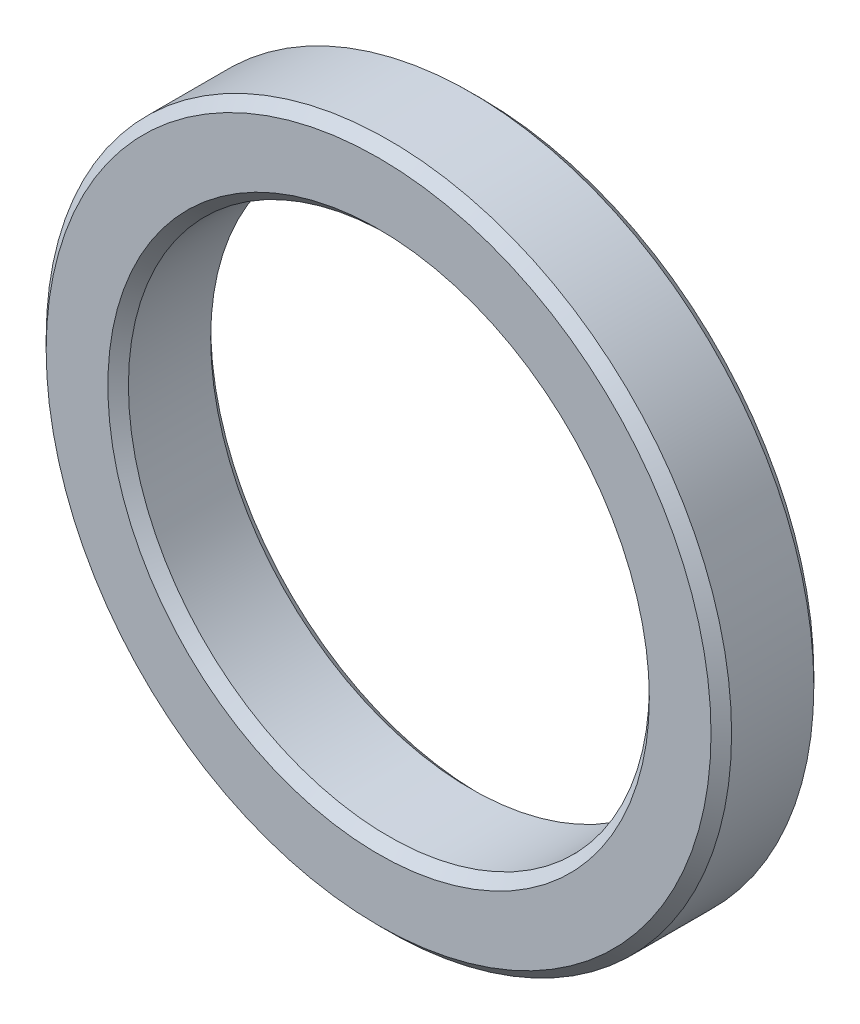
ISO-10303-21;
HEADER;
FILE_DESCRIPTION(('STEP AP214'),'2;1');
FILE_NAME('part.step','',(''),(''),'','','');
FILE_SCHEMA(('AUTOMOTIVE_DESIGN { 1 0 10303 214 1 1 1 1 }'));
ENDSEC;
DATA;
#1=APPLICATION_CONTEXT('core data for automotive mechanical design processes');
#2=APPLICATION_PROTOCOL_DEFINITION('international standard','automotive_design',2000,#1);
#3=PRODUCT_CONTEXT('',#1,'mechanical');
#4=PRODUCT('Part','Part','',(#3));
#5=PRODUCT_RELATED_PRODUCT_CATEGORY('part','',(#4));
#6=PRODUCT_DEFINITION_FORMATION('','',#4);
#7=PRODUCT_DEFINITION_CONTEXT('part definition',#1,'design');
#8=PRODUCT_DEFINITION('design','',#6,#7);
#9=PRODUCT_DEFINITION_SHAPE('','',#8);
#10=(LENGTH_UNIT() NAMED_UNIT(*) SI_UNIT(.MILLI.,.METRE.));
#11=(NAMED_UNIT(*) PLANE_ANGLE_UNIT() SI_UNIT($,.RADIAN.));
#12=(NAMED_UNIT(*) SI_UNIT($,.STERADIAN.) SOLID_ANGLE_UNIT());
#13=UNCERTAINTY_MEASURE_WITH_UNIT(LENGTH_MEASURE(1.E-05),#10,'distance_accuracy_value','');
#14=(GEOMETRIC_REPRESENTATION_CONTEXT(3) GLOBAL_UNCERTAINTY_ASSIGNED_CONTEXT((#13)) GLOBAL_UNIT_ASSIGNED_CONTEXT((#10,
#11,#12)) REPRESENTATION_CONTEXT('',''));
#15=CARTESIAN_POINT('',(0.,0.,0.));
#16=DIRECTION('',(0.,0.,1.));
#17=DIRECTION('',(1.,0.,0.));
#18=AXIS2_PLACEMENT_3D('',#15,#16,#17);
#19=CARTESIAN_POINT('',(0.,0.,3.));
#20=DIRECTION('',(0.,0.,1.));
#21=DIRECTION('',(1.,0.,0.));
#22=AXIS2_PLACEMENT_3D('',#19,#20,#21);
#23=PLANE('',#22);
#24=CARTESIAN_POINT('',(0.,0.,3.));
#25=DIRECTION('',(0.,0.,1.));
#26=DIRECTION('',(1.,0.,0.));
#27=AXIS2_PLACEMENT_3D('',#24,#25,#26);
#28=CIRCLE('',#27,9.70000000000001);
#29=CARTESIAN_POINT('',(9.70000000000001,0.,3.));
#30=VERTEX_POINT('',#29);
#31=EDGE_CURVE('E49',#30,#30,#28,.T.);
#32=ORIENTED_EDGE('',*,*,#31,.T.);
#33=EDGE_LOOP('',(#32));
#34=FACE_BOUND('',#33,.T.);
#35=CARTESIAN_POINT('',(0.,0.,3.));
#36=DIRECTION('',(0.,0.,1.));
#37=DIRECTION('',(1.,0.,0.));
#38=AXIS2_PLACEMENT_3D('',#35,#36,#37);
#39=CIRCLE('',#38,7.9);
#40=CARTESIAN_POINT('',(7.9,0.,3.));
#41=VERTEX_POINT('',#40);
#42=EDGE_CURVE('E53',#41,#41,#39,.F.);
#43=ORIENTED_EDGE('',*,*,#42,.T.);
#44=EDGE_LOOP('',(#43));
#45=FACE_BOUND('',#44,.T.);
#46=ADVANCED_FACE('F37',(#34,#45),#23,.T.);
#47=CARTESIAN_POINT('',(0.,0.,0.));
#48=DIRECTION('',(0.,0.,1.));
#49=DIRECTION('',(1.,0.,0.));
#50=AXIS2_PLACEMENT_3D('',#47,#48,#49);
#51=PLANE('',#50);
#52=CARTESIAN_POINT('',(0.,0.,0.));
#53=DIRECTION('',(0.,0.,1.));
#54=DIRECTION('',(1.,0.,0.));
#55=AXIS2_PLACEMENT_3D('',#52,#53,#54);
#56=CIRCLE('',#55,9.7);
#57=CARTESIAN_POINT('',(9.7,0.,0.));
#58=VERTEX_POINT('',#57);
#59=EDGE_CURVE('E58',#58,#58,#56,.F.);
#60=ORIENTED_EDGE('',*,*,#59,.T.);
#61=EDGE_LOOP('',(#60));
#62=FACE_BOUND('',#61,.T.);
#63=CARTESIAN_POINT('',(0.,0.,0.));
#64=DIRECTION('',(0.,0.,1.));
#65=DIRECTION('',(1.,0.,0.));
#66=AXIS2_PLACEMENT_3D('',#63,#64,#65);
#67=CIRCLE('',#66,7.9);
#68=CARTESIAN_POINT('',(7.9,0.,0.));
#69=VERTEX_POINT('',#68);
#70=EDGE_CURVE('E61',#69,#69,#67,.T.);
#71=ORIENTED_EDGE('',*,*,#70,.T.);
#72=EDGE_LOOP('',(#71));
#73=FACE_BOUND('',#72,.T.);
#74=ADVANCED_FACE('F83',(#62,#73),#51,.F.);
#75=CARTESIAN_POINT('',(0.,0.,3.));
#76=DIRECTION('',(0.,0.,-1.));
#77=DIRECTION('',(-1.,0.,0.));
#78=AXIS2_PLACEMENT_3D('',#75,#76,#77);
#79=CYLINDRICAL_SURFACE('',#78,10.);
#80=CARTESIAN_POINT('',(0.,0.,0.299999999999998));
#81=DIRECTION('',(0.,0.,1.));
#82=DIRECTION('',(1.,0.,0.));
#83=AXIS2_PLACEMENT_3D('',#80,#81,#82);
#84=CIRCLE('',#83,10.);
#85=CARTESIAN_POINT('',(10.,0.,0.299999999999998));
#86=VERTEX_POINT('',#85);
#87=EDGE_CURVE('E64',#86,#86,#84,.T.);
#88=ORIENTED_EDGE('',*,*,#87,.T.);
#89=EDGE_LOOP('',(#88));
#90=FACE_BOUND('',#89,.T.);
#91=CARTESIAN_POINT('',(0.,0.,2.70000000000001));
#92=DIRECTION('',(0.,0.,1.));
#93=DIRECTION('',(1.,0.,0.));
#94=AXIS2_PLACEMENT_3D('',#91,#92,#93);
#95=CIRCLE('',#94,10.);
#96=CARTESIAN_POINT('',(10.,0.,2.70000000000001));
#97=VERTEX_POINT('',#96);
#98=EDGE_CURVE('E67',#97,#97,#95,.F.);
#99=ORIENTED_EDGE('',*,*,#98,.T.);
#100=EDGE_LOOP('',(#99));
#101=FACE_BOUND('',#100,.T.);
#102=ADVANCED_FACE('F71',(#90,#101),#79,.T.);
#103=CARTESIAN_POINT('',(0.,0.,3.));
#104=DIRECTION('',(0.,0.,-1.));
#105=DIRECTION('',(-1.,0.,0.));
#106=AXIS2_PLACEMENT_3D('',#103,#104,#105);
#107=CYLINDRICAL_SURFACE('',#106,7.6);
#108=CARTESIAN_POINT('',(0.,0.,0.300000000000003));
#109=DIRECTION('',(0.,0.,1.));
#110=DIRECTION('',(1.,0.,0.));
#111=AXIS2_PLACEMENT_3D('',#108,#109,#110);
#112=CIRCLE('',#111,7.6);
#113=CARTESIAN_POINT('',(7.6,0.,0.300000000000003));
#114=VERTEX_POINT('',#113);
#115=EDGE_CURVE('E10',#114,#114,#112,.F.);
#116=ORIENTED_EDGE('',*,*,#115,.T.);
#117=EDGE_LOOP('',(#116));
#118=FACE_BOUND('',#117,.T.);
#119=CARTESIAN_POINT('',(0.,0.,2.7));
#120=DIRECTION('',(0.,0.,1.));
#121=DIRECTION('',(1.,0.,0.));
#122=AXIS2_PLACEMENT_3D('',#119,#120,#121);
#123=CIRCLE('',#122,7.6);
#124=CARTESIAN_POINT('',(7.6,0.,2.7));
#125=VERTEX_POINT('',#124);
#126=EDGE_CURVE('E45',#125,#125,#123,.T.);
#127=ORIENTED_EDGE('',*,*,#126,.T.);
#128=EDGE_LOOP('',(#127));
#129=FACE_BOUND('',#128,.T.);
#130=ADVANCED_FACE('F108',(#118,#129),#107,.F.);
#131=CARTESIAN_POINT('',(0.,0.,0.299999999999998));
#132=DIRECTION('',(0.,0.,1.));
#133=DIRECTION('',(1.,0.,0.));
#134=AXIS2_PLACEMENT_3D('',#131,#132,#133);
#135=CONICAL_SURFACE('',#134,10.,0.785398163397451);
#136=ORIENTED_EDGE('',*,*,#59,.F.);
#137=EDGE_LOOP('',(#136));
#138=FACE_BOUND('',#137,.T.);
#139=ORIENTED_EDGE('',*,*,#87,.F.);
#140=EDGE_LOOP('',(#139));
#141=FACE_BOUND('',#140,.T.);
#142=ADVANCED_FACE('F77',(#138,#141),#135,.T.);
#143=CARTESIAN_POINT('',(0.,0.,3.));
#144=DIRECTION('',(0.,0.,-1.));
#145=DIRECTION('',(-1.,0.,0.));
#146=AXIS2_PLACEMENT_3D('',#143,#144,#145);
#147=CONICAL_SURFACE('',#146,9.70000000000001,0.785398163397445);
#148=ORIENTED_EDGE('',*,*,#98,.F.);
#149=EDGE_LOOP('',(#148));
#150=FACE_BOUND('',#149,.T.);
#151=ORIENTED_EDGE('',*,*,#31,.F.);
#152=EDGE_LOOP('',(#151));
#153=FACE_BOUND('',#152,.T.);
#154=ADVANCED_FACE('F73',(#150,#153),#147,.T.);
#155=CARTESIAN_POINT('',(0.,0.,0.));
#156=DIRECTION('',(0.,0.,-1.));
#157=DIRECTION('',(-1.,0.,0.));
#158=AXIS2_PLACEMENT_3D('',#155,#156,#157);
#159=CONICAL_SURFACE('',#158,7.9,0.785398163397447);
#160=ORIENTED_EDGE('',*,*,#115,.F.);
#161=EDGE_LOOP('',(#160));
#162=FACE_BOUND('',#161,.T.);
#163=ORIENTED_EDGE('',*,*,#70,.F.);
#164=EDGE_LOOP('',(#163));
#165=FACE_BOUND('',#164,.T.);
#166=ADVANCED_FACE('F76',(#162,#165),#159,.F.);
#167=CARTESIAN_POINT('',(0.,0.,2.7));
#168=DIRECTION('',(0.,0.,1.));
#169=DIRECTION('',(1.,0.,0.));
#170=AXIS2_PLACEMENT_3D('',#167,#168,#169);
#171=CONICAL_SURFACE('',#170,7.6,0.785398163397447);
#172=ORIENTED_EDGE('',*,*,#42,.F.);
#173=EDGE_LOOP('',(#172));
#174=FACE_BOUND('',#173,.T.);
#175=ORIENTED_EDGE('',*,*,#126,.F.);
#176=EDGE_LOOP('',(#175));
#177=FACE_BOUND('',#176,.T.);
#178=ADVANCED_FACE('F40',(#174,#177),#171,.F.);
#179=CLOSED_SHELL('',(#46,#74,#102,#130,#142,#154,#166,#178));
#180=MANIFOLD_SOLID_BREP('B2',#179);
#181=ADVANCED_BREP_SHAPE_REPRESENTATION('',(#18,#180),#14);
#182=SHAPE_DEFINITION_REPRESENTATION(#9,#181);
ENDSEC;
END-ISO-10303-21;
